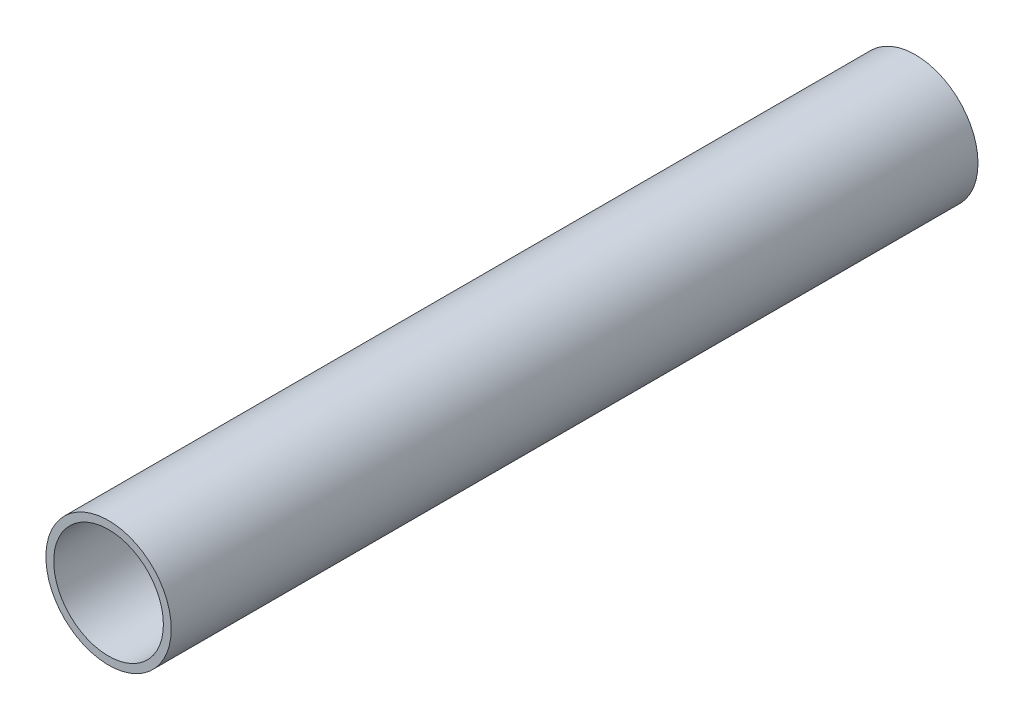
ISO-10303-21;
HEADER;
FILE_DESCRIPTION(('STEP AP214'),'2;1');
FILE_NAME('part.step','',(''),(''),'','','');
FILE_SCHEMA(('AUTOMOTIVE_DESIGN { 1 0 10303 214 1 1 1 1 }'));
ENDSEC;
DATA;
#1=APPLICATION_CONTEXT('core data for automotive mechanical design processes');
#2=APPLICATION_PROTOCOL_DEFINITION('international standard','automotive_design',2000,#1);
#3=PRODUCT_CONTEXT('',#1,'mechanical');
#4=PRODUCT('Part','Part','',(#3));
#5=PRODUCT_RELATED_PRODUCT_CATEGORY('part','',(#4));
#6=PRODUCT_DEFINITION_FORMATION('','',#4);
#7=PRODUCT_DEFINITION_CONTEXT('part definition',#1,'design');
#8=PRODUCT_DEFINITION('design','',#6,#7);
#9=PRODUCT_DEFINITION_SHAPE('','',#8);
#10=(LENGTH_UNIT() NAMED_UNIT(*) SI_UNIT(.MILLI.,.METRE.));
#11=(NAMED_UNIT(*) PLANE_ANGLE_UNIT() SI_UNIT($,.RADIAN.));
#12=(NAMED_UNIT(*) SI_UNIT($,.STERADIAN.) SOLID_ANGLE_UNIT());
#13=UNCERTAINTY_MEASURE_WITH_UNIT(LENGTH_MEASURE(1.E-05),#10,'distance_accuracy_value','');
#14=(GEOMETRIC_REPRESENTATION_CONTEXT(3) GLOBAL_UNCERTAINTY_ASSIGNED_CONTEXT((#13)) GLOBAL_UNIT_ASSIGNED_CONTEXT((#10,
#11,#12)) REPRESENTATION_CONTEXT('',''));
#15=CARTESIAN_POINT('',(0.,0.,0.));
#16=DIRECTION('',(0.,0.,1.));
#17=DIRECTION('',(1.,0.,0.));
#18=AXIS2_PLACEMENT_3D('',#15,#16,#17);
#19=CARTESIAN_POINT('',(0.,0.,103.));
#20=DIRECTION('',(0.,0.,1.));
#21=DIRECTION('',(1.,0.,0.));
#22=AXIS2_PLACEMENT_3D('',#19,#20,#21);
#23=PLANE('',#22);
#24=CARTESIAN_POINT('',(0.,0.,103.));
#25=DIRECTION('',(0.,0.,1.));
#26=DIRECTION('',(1.,0.,0.));
#27=AXIS2_PLACEMENT_3D('',#24,#25,#26);
#28=CIRCLE('',#27,8.);
#29=CARTESIAN_POINT('',(8.,0.,103.));
#30=VERTEX_POINT('',#29);
#31=EDGE_CURVE('E10',#30,#30,#28,.T.);
#32=ORIENTED_EDGE('',*,*,#31,.T.);
#33=EDGE_LOOP('',(#32));
#34=FACE_BOUND('',#33,.T.);
#35=CARTESIAN_POINT('',(0.,0.,103.));
#36=DIRECTION('',(0.,0.,1.));
#37=DIRECTION('',(1.,0.,0.));
#38=AXIS2_PLACEMENT_3D('',#35,#36,#37);
#39=CIRCLE('',#38,7.);
#40=CARTESIAN_POINT('',(7.,0.,103.));
#41=VERTEX_POINT('',#40);
#42=EDGE_CURVE('E50',#41,#41,#39,.T.);
#43=ORIENTED_EDGE('',*,*,#42,.F.);
#44=EDGE_LOOP('',(#43));
#45=FACE_BOUND('',#44,.T.);
#46=ADVANCED_FACE('F36',(#34,#45),#23,.T.);
#47=CARTESIAN_POINT('',(0.,0.,0.));
#48=DIRECTION('',(0.,0.,1.));
#49=DIRECTION('',(1.,0.,0.));
#50=AXIS2_PLACEMENT_3D('',#47,#48,#49);
#51=PLANE('',#50);
#52=CARTESIAN_POINT('',(0.,0.,0.));
#53=DIRECTION('',(0.,0.,1.));
#54=DIRECTION('',(1.,0.,0.));
#55=AXIS2_PLACEMENT_3D('',#52,#53,#54);
#56=CIRCLE('',#55,8.);
#57=CARTESIAN_POINT('',(8.,0.,0.));
#58=VERTEX_POINT('',#57);
#59=EDGE_CURVE('E40',#58,#58,#56,.T.);
#60=ORIENTED_EDGE('',*,*,#59,.F.);
#61=EDGE_LOOP('',(#60));
#62=FACE_BOUND('',#61,.T.);
#63=CARTESIAN_POINT('',(0.,0.,0.));
#64=DIRECTION('',(0.,0.,1.));
#65=DIRECTION('',(1.,0.,0.));
#66=AXIS2_PLACEMENT_3D('',#63,#64,#65);
#67=CIRCLE('',#66,7.);
#68=CARTESIAN_POINT('',(7.,0.,0.));
#69=VERTEX_POINT('',#68);
#70=EDGE_CURVE('E52',#69,#69,#67,.T.);
#71=ORIENTED_EDGE('',*,*,#70,.T.);
#72=EDGE_LOOP('',(#71));
#73=FACE_BOUND('',#72,.T.);
#74=ADVANCED_FACE('F65',(#62,#73),#51,.F.);
#75=CARTESIAN_POINT('',(0.,0.,103.));
#76=DIRECTION('',(0.,0.,-1.));
#77=DIRECTION('',(-1.,0.,0.));
#78=AXIS2_PLACEMENT_3D('',#75,#76,#77);
#79=CYLINDRICAL_SURFACE('',#78,8.);
#80=ORIENTED_EDGE('',*,*,#31,.F.);
#81=EDGE_LOOP('',(#80));
#82=FACE_BOUND('',#81,.T.);
#83=ORIENTED_EDGE('',*,*,#59,.T.);
#84=EDGE_LOOP('',(#83));
#85=FACE_BOUND('',#84,.T.);
#86=ADVANCED_FACE('F38',(#82,#85),#79,.T.);
#87=CARTESIAN_POINT('',(0.,0.,103.));
#88=DIRECTION('',(0.,0.,-1.));
#89=DIRECTION('',(-1.,0.,0.));
#90=AXIS2_PLACEMENT_3D('',#87,#88,#89);
#91=CYLINDRICAL_SURFACE('',#90,7.);
#92=ORIENTED_EDGE('',*,*,#42,.T.);
#93=EDGE_LOOP('',(#92));
#94=FACE_BOUND('',#93,.T.);
#95=ORIENTED_EDGE('',*,*,#70,.F.);
#96=EDGE_LOOP('',(#95));
#97=FACE_BOUND('',#96,.T.);
#98=ADVANCED_FACE('F61',(#94,#97),#91,.F.);
#99=CLOSED_SHELL('',(#46,#74,#86,#98));
#100=MANIFOLD_SOLID_BREP('B2',#99);
#101=ADVANCED_BREP_SHAPE_REPRESENTATION('',(#18,#100),#14);
#102=SHAPE_DEFINITION_REPRESENTATION(#9,#101);
ENDSEC;
END-ISO-10303-21;
